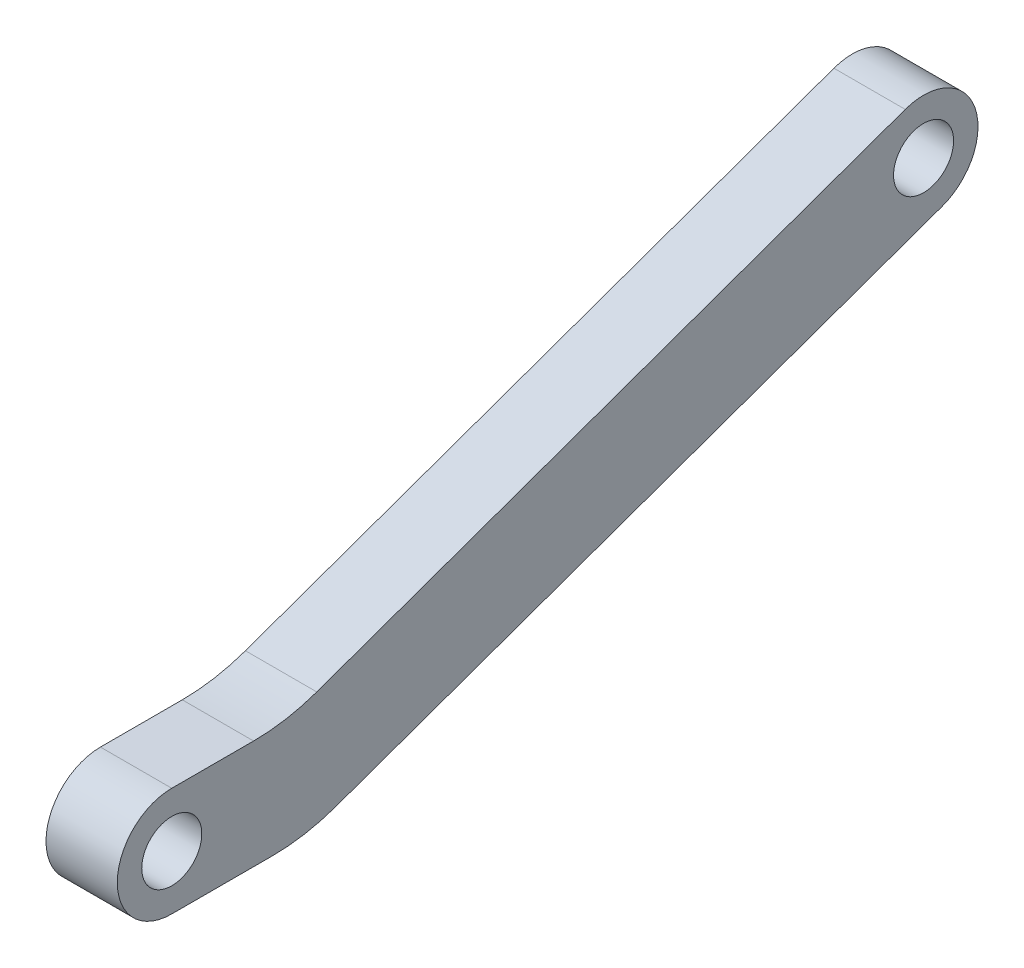
ISO-10303-21;
HEADER;
FILE_DESCRIPTION(('STEP AP214'),'2;1');
FILE_NAME('part.step','',(''),(''),'','','');
FILE_SCHEMA(('AUTOMOTIVE_DESIGN { 1 0 10303 214 1 1 1 1 }'));
ENDSEC;
DATA;
#1=APPLICATION_CONTEXT('core data for automotive mechanical design processes');
#2=APPLICATION_PROTOCOL_DEFINITION('international standard','automotive_design',2000,#1);
#3=PRODUCT_CONTEXT('',#1,'mechanical');
#4=PRODUCT('Part','Part','',(#3));
#5=PRODUCT_RELATED_PRODUCT_CATEGORY('part','',(#4));
#6=PRODUCT_DEFINITION_FORMATION('','',#4);
#7=PRODUCT_DEFINITION_CONTEXT('part definition',#1,'design');
#8=PRODUCT_DEFINITION('design','',#6,#7);
#9=PRODUCT_DEFINITION_SHAPE('','',#8);
#10=(LENGTH_UNIT() NAMED_UNIT(*) SI_UNIT(.MILLI.,.METRE.));
#11=(NAMED_UNIT(*) PLANE_ANGLE_UNIT() SI_UNIT($,.RADIAN.));
#12=(NAMED_UNIT(*) SI_UNIT($,.STERADIAN.) SOLID_ANGLE_UNIT());
#13=UNCERTAINTY_MEASURE_WITH_UNIT(LENGTH_MEASURE(1.E-05),#10,'distance_accuracy_value','');
#14=(GEOMETRIC_REPRESENTATION_CONTEXT(3) GLOBAL_UNCERTAINTY_ASSIGNED_CONTEXT((#13)) GLOBAL_UNIT_ASSIGNED_CONTEXT((#10,
#11,#12)) REPRESENTATION_CONTEXT('',''));
#15=CARTESIAN_POINT('',(0.,0.,0.));
#16=DIRECTION('',(0.,0.,1.));
#17=DIRECTION('',(1.,0.,0.));
#18=AXIS2_PLACEMENT_3D('',#15,#16,#17);
#19=CARTESIAN_POINT('',(1.9,7.1,-5.36430945089111));
#20=DIRECTION('',(1.,0.,0.));
#21=DIRECTION('',(0.,0.,-1.));
#22=AXIS2_PLACEMENT_3D('',#19,#20,#21);
#23=PLANE('',#22);
#24=CARTESIAN_POINT('',(1.9,0.,0.));
#25=DIRECTION('',(1.,0.,0.));
#26=DIRECTION('',(0.,0.,-1.));
#27=AXIS2_PLACEMENT_3D('',#24,#25,#26);
#28=CIRCLE('',#27,1.6);
#29=CARTESIAN_POINT('',(1.9,0.,1.6));
#30=VERTEX_POINT('',#29);
#31=EDGE_CURVE('E142',#30,#30,#28,.T.);
#32=ORIENTED_EDGE('',*,*,#31,.F.);
#33=EDGE_LOOP('',(#32));
#34=FACE_BOUND('',#33,.T.);
#35=CARTESIAN_POINT('',(1.9,7.1,-5.36430945089111));
#36=DIRECTION('',(1.,0.,0.));
#37=DIRECTION('',(0.,0.,-1.));
#38=AXIS2_PLACEMENT_3D('',#35,#36,#37);
#39=CIRCLE('',#38,10.);
#40=CARTESIAN_POINT('',(1.9,-2.9,-5.36430945089111));
#41=VERTEX_POINT('',#40);
#42=CARTESIAN_POINT('',(1.9,-2.31728298081775,-8.72805457488616));
#43=VERTEX_POINT('',#42);
#44=EDGE_CURVE('E153',#41,#43,#39,.T.);
#45=ORIENTED_EDGE('',*,*,#44,.T.);
#46=DIRECTION('',(0.,0.336374512399505,-0.941728298081774));
#47=VECTOR('',#46,1.);
#48=CARTESIAN_POINT('',(1.9,-2.31728298081775,-8.72805457488616));
#49=LINE('',#48,#47);
#50=CARTESIAN_POINT('',(1.9,9.21898793556285,-41.0254860859586));
#51=VERTEX_POINT('',#50);
#52=EDGE_CURVE('E101',#43,#51,#49,.T.);
#53=ORIENTED_EDGE('',*,*,#52,.T.);
#54=CARTESIAN_POINT('',(1.9,11.95,-40.05));
#55=DIRECTION('',(1.,0.,0.));
#56=DIRECTION('',(0.,0.,-1.));
#57=AXIS2_PLACEMENT_3D('',#54,#55,#56);
#58=CIRCLE('',#57,2.9);
#59=CARTESIAN_POINT('',(1.9,14.6810120644371,-39.0745139140414));
#60=VERTEX_POINT('',#59);
#61=EDGE_CURVE('E168',#51,#60,#58,.T.);
#62=ORIENTED_EDGE('',*,*,#61,.T.);
#63=DIRECTION('',(0.,-0.336374512399505,0.941728298081775));
#64=VECTOR('',#63,1.);
#65=CARTESIAN_POINT('',(1.9,3.48271701918226,-7.72329393260449));
#66=LINE('',#65,#64);
#67=CARTESIAN_POINT('',(1.9,3.48271701918225,-7.72329393260448));
#68=VERTEX_POINT('',#67);
#69=EDGE_CURVE('E181',#60,#68,#66,.T.);
#70=ORIENTED_EDGE('',*,*,#69,.T.);
#71=CARTESIAN_POINT('',(1.9,12.9,-4.35954880860944));
#72=DIRECTION('',(-1.,0.,0.));
#73=DIRECTION('',(0.,0.,-1.));
#74=AXIS2_PLACEMENT_3D('',#71,#72,#73);
#75=CIRCLE('',#74,10.);
#76=CARTESIAN_POINT('',(1.9,2.9,-4.35954880860944));
#77=VERTEX_POINT('',#76);
#78=EDGE_CURVE('E120',#68,#77,#75,.T.);
#79=ORIENTED_EDGE('',*,*,#78,.T.);
#80=DIRECTION('',(0.,0.,1.));
#81=VECTOR('',#80,1.);
#82=CARTESIAN_POINT('',(1.9,2.9,0.));
#83=LINE('',#82,#81);
#84=CARTESIAN_POINT('',(1.9,2.9,0.));
#85=VERTEX_POINT('',#84);
#86=EDGE_CURVE('E114',#77,#85,#83,.T.);
#87=ORIENTED_EDGE('',*,*,#86,.T.);
#88=CARTESIAN_POINT('',(1.9,0.,0.));
#89=DIRECTION('',(1.,0.,0.));
#90=DIRECTION('',(0.,0.,-1.));
#91=AXIS2_PLACEMENT_3D('',#88,#89,#90);
#92=CIRCLE('',#91,2.9);
#93=CARTESIAN_POINT('',(1.9,-2.9,0.));
#94=VERTEX_POINT('',#93);
#95=EDGE_CURVE('E118',#85,#94,#92,.T.);
#96=ORIENTED_EDGE('',*,*,#95,.T.);
#97=DIRECTION('',(0.,0.,-1.));
#98=VECTOR('',#97,1.);
#99=CARTESIAN_POINT('',(1.9,-2.9,0.));
#100=LINE('',#99,#98);
#101=EDGE_CURVE('E58',#94,#41,#100,.T.);
#102=ORIENTED_EDGE('',*,*,#101,.T.);
#103=EDGE_LOOP('',(#45,#53,#62,#70,#79,#87,#96,#102));
#104=FACE_BOUND('',#103,.T.);
#105=CARTESIAN_POINT('',(1.9,11.95,-40.05));
#106=DIRECTION('',(1.,0.,0.));
#107=DIRECTION('',(0.,0.,-1.));
#108=AXIS2_PLACEMENT_3D('',#105,#106,#107);
#109=CIRCLE('',#108,1.6);
#110=CARTESIAN_POINT('',(1.9,11.95,-38.45));
#111=VERTEX_POINT('',#110);
#112=EDGE_CURVE('E190',#111,#111,#109,.T.);
#113=ORIENTED_EDGE('',*,*,#112,.F.);
#114=EDGE_LOOP('',(#113));
#115=FACE_BOUND('',#114,.T.);
#116=ADVANCED_FACE('F41',(#34,#104,#115),#23,.T.);
#117=CARTESIAN_POINT('',(-1.9,7.1,-5.36430945089111));
#118=DIRECTION('',(1.,0.,0.));
#119=DIRECTION('',(0.,0.,-1.));
#120=AXIS2_PLACEMENT_3D('',#117,#118,#119);
#121=PLANE('',#120);
#122=CARTESIAN_POINT('',(-1.9,7.1,-5.36430945089111));
#123=DIRECTION('',(1.,0.,0.));
#124=DIRECTION('',(0.,0.,-1.));
#125=AXIS2_PLACEMENT_3D('',#122,#123,#124);
#126=CIRCLE('',#125,10.);
#127=CARTESIAN_POINT('',(-1.9,-2.9,-5.36430945089111));
#128=VERTEX_POINT('',#127);
#129=CARTESIAN_POINT('',(-1.9,-2.31728298081775,-8.72805457488616));
#130=VERTEX_POINT('',#129);
#131=EDGE_CURVE('E138',#128,#130,#126,.T.);
#132=ORIENTED_EDGE('',*,*,#131,.F.);
#133=DIRECTION('',(0.,0.,-1.));
#134=VECTOR('',#133,1.);
#135=CARTESIAN_POINT('',(-1.9,-2.9,0.));
#136=LINE('',#135,#134);
#137=CARTESIAN_POINT('',(-1.9,-2.9,0.));
#138=VERTEX_POINT('',#137);
#139=EDGE_CURVE('E93',#138,#128,#136,.T.);
#140=ORIENTED_EDGE('',*,*,#139,.F.);
#141=CARTESIAN_POINT('',(-1.9,0.,0.));
#142=DIRECTION('',(1.,0.,0.));
#143=DIRECTION('',(0.,0.,-1.));
#144=AXIS2_PLACEMENT_3D('',#141,#142,#143);
#145=CIRCLE('',#144,2.9);
#146=CARTESIAN_POINT('',(-1.9,2.9,0.));
#147=VERTEX_POINT('',#146);
#148=EDGE_CURVE('E87',#147,#138,#145,.T.);
#149=ORIENTED_EDGE('',*,*,#148,.F.);
#150=DIRECTION('',(0.,0.,1.));
#151=VECTOR('',#150,1.);
#152=CARTESIAN_POINT('',(-1.9,2.9,0.));
#153=LINE('',#152,#151);
#154=CARTESIAN_POINT('',(-1.9,2.9,-4.35954880860944));
#155=VERTEX_POINT('',#154);
#156=EDGE_CURVE('E128',#155,#147,#153,.T.);
#157=ORIENTED_EDGE('',*,*,#156,.F.);
#158=CARTESIAN_POINT('',(-1.9,12.9,-4.35954880860944));
#159=DIRECTION('',(-1.,0.,0.));
#160=DIRECTION('',(0.,0.,-1.));
#161=AXIS2_PLACEMENT_3D('',#158,#159,#160);
#162=CIRCLE('',#161,10.);
#163=CARTESIAN_POINT('',(-1.9,3.48271701918225,-7.72329393260448));
#164=VERTEX_POINT('',#163);
#165=EDGE_CURVE('E148',#164,#155,#162,.T.);
#166=ORIENTED_EDGE('',*,*,#165,.F.);
#167=DIRECTION('',(0.,-0.336374512399505,0.941728298081775));
#168=VECTOR('',#167,1.);
#169=CARTESIAN_POINT('',(-1.9,3.48271701918226,-7.72329393260449));
#170=LINE('',#169,#168);
#171=CARTESIAN_POINT('',(-1.9,14.6810120644371,-39.0745139140414));
#172=VERTEX_POINT('',#171);
#173=EDGE_CURVE('E146',#172,#164,#170,.T.);
#174=ORIENTED_EDGE('',*,*,#173,.F.);
#175=CARTESIAN_POINT('',(-1.9,11.95,-40.05));
#176=DIRECTION('',(1.,0.,0.));
#177=DIRECTION('',(0.,0.,-1.));
#178=AXIS2_PLACEMENT_3D('',#175,#176,#177);
#179=CIRCLE('',#178,2.9);
#180=CARTESIAN_POINT('',(-1.9,9.21898793556285,-41.0254860859586));
#181=VERTEX_POINT('',#180);
#182=EDGE_CURVE('E144',#181,#172,#179,.T.);
#183=ORIENTED_EDGE('',*,*,#182,.F.);
#184=DIRECTION('',(0.,0.336374512399505,-0.941728298081774));
#185=VECTOR('',#184,1.);
#186=CARTESIAN_POINT('',(-1.9,-2.31728298081775,-8.72805457488616));
#187=LINE('',#186,#185);
#188=EDGE_CURVE('E141',#130,#181,#187,.T.);
#189=ORIENTED_EDGE('',*,*,#188,.F.);
#190=EDGE_LOOP('',(#132,#140,#149,#157,#166,#174,#183,#189));
#191=FACE_BOUND('',#190,.T.);
#192=CARTESIAN_POINT('',(-1.9,0.,0.));
#193=DIRECTION('',(1.,0.,0.));
#194=DIRECTION('',(0.,0.,-1.));
#195=AXIS2_PLACEMENT_3D('',#192,#193,#194);
#196=CIRCLE('',#195,1.6);
#197=CARTESIAN_POINT('',(-1.9,0.,1.6));
#198=VERTEX_POINT('',#197);
#199=EDGE_CURVE('E187',#198,#198,#196,.T.);
#200=ORIENTED_EDGE('',*,*,#199,.T.);
#201=EDGE_LOOP('',(#200));
#202=FACE_BOUND('',#201,.T.);
#203=CARTESIAN_POINT('',(-1.9,11.95,-40.05));
#204=DIRECTION('',(1.,0.,0.));
#205=DIRECTION('',(0.,0.,-1.));
#206=AXIS2_PLACEMENT_3D('',#203,#204,#205);
#207=CIRCLE('',#206,1.6);
#208=CARTESIAN_POINT('',(-1.9,11.95,-38.45));
#209=VERTEX_POINT('',#208);
#210=EDGE_CURVE('E193',#209,#209,#207,.T.);
#211=ORIENTED_EDGE('',*,*,#210,.T.);
#212=EDGE_LOOP('',(#211));
#213=FACE_BOUND('',#212,.T.);
#214=ADVANCED_FACE('F172',(#191,#202,#213),#121,.F.);
#215=CARTESIAN_POINT('',(1.9,7.1,-5.36430945089111));
#216=DIRECTION('',(-1.,0.,0.));
#217=DIRECTION('',(0.,0.,1.));
#218=AXIS2_PLACEMENT_3D('',#215,#216,#217);
#219=CYLINDRICAL_SURFACE('',#218,10.);
#220=ORIENTED_EDGE('',*,*,#131,.T.);
#221=DIRECTION('',(-1.,0.,0.));
#222=VECTOR('',#221,1.);
#223=CARTESIAN_POINT('',(1.9,-2.31728298081775,-8.72805457488616));
#224=LINE('',#223,#222);
#225=EDGE_CURVE('E11',#43,#130,#224,.T.);
#226=ORIENTED_EDGE('',*,*,#225,.F.);
#227=ORIENTED_EDGE('',*,*,#44,.F.);
#228=DIRECTION('',(-1.,0.,0.));
#229=VECTOR('',#228,1.);
#230=CARTESIAN_POINT('',(1.9,-2.9,-5.36430945089111));
#231=LINE('',#230,#229);
#232=EDGE_CURVE('E134',#41,#128,#231,.T.);
#233=ORIENTED_EDGE('',*,*,#232,.T.);
#234=EDGE_LOOP('',(#220,#226,#227,#233));
#235=FACE_BOUND('',#234,.T.);
#236=ADVANCED_FACE('F43',(#235),#219,.T.);
#237=CARTESIAN_POINT('',(1.9,-2.31728298081775,-8.72805457488616));
#238=DIRECTION('',(0.,0.941728298081774,0.336374512399505));
#239=DIRECTION('',(0.,-0.336374512399505,0.941728298081774));
#240=AXIS2_PLACEMENT_3D('',#237,#238,#239);
#241=PLANE('',#240);
#242=ORIENTED_EDGE('',*,*,#188,.T.);
#243=DIRECTION('',(-1.,0.,0.));
#244=VECTOR('',#243,1.);
#245=CARTESIAN_POINT('',(1.9,9.21898793556285,-41.0254860859586));
#246=LINE('',#245,#244);
#247=EDGE_CURVE('E50',#51,#181,#246,.T.);
#248=ORIENTED_EDGE('',*,*,#247,.F.);
#249=ORIENTED_EDGE('',*,*,#52,.F.);
#250=ORIENTED_EDGE('',*,*,#225,.T.);
#251=EDGE_LOOP('',(#242,#248,#249,#250));
#252=FACE_BOUND('',#251,.T.);
#253=ADVANCED_FACE('F225',(#252),#241,.F.);
#254=CARTESIAN_POINT('',(1.9,11.95,-40.05));
#255=DIRECTION('',(-1.,0.,0.));
#256=DIRECTION('',(0.,0.,1.));
#257=AXIS2_PLACEMENT_3D('',#254,#255,#256);
#258=CYLINDRICAL_SURFACE('',#257,2.9);
#259=ORIENTED_EDGE('',*,*,#182,.T.);
#260=DIRECTION('',(-1.,0.,0.));
#261=VECTOR('',#260,1.);
#262=CARTESIAN_POINT('',(1.9,14.6810120644371,-39.0745139140414));
#263=LINE('',#262,#261);
#264=EDGE_CURVE('E160',#60,#172,#263,.T.);
#265=ORIENTED_EDGE('',*,*,#264,.F.);
#266=ORIENTED_EDGE('',*,*,#61,.F.);
#267=ORIENTED_EDGE('',*,*,#247,.T.);
#268=EDGE_LOOP('',(#259,#265,#266,#267));
#269=FACE_BOUND('',#268,.T.);
#270=ADVANCED_FACE('F166',(#269),#258,.T.);
#271=CARTESIAN_POINT('',(1.9,3.48271701918226,-7.72329393260449));
#272=DIRECTION('',(0.,-0.941728298081774,-0.336374512399505));
#273=DIRECTION('',(0.,0.336374512399505,-0.941728298081774));
#274=AXIS2_PLACEMENT_3D('',#271,#272,#273);
#275=PLANE('',#274);
#276=ORIENTED_EDGE('',*,*,#173,.T.);
#277=DIRECTION('',(-1.,0.,0.));
#278=VECTOR('',#277,1.);
#279=CARTESIAN_POINT('',(1.9,3.48271701918225,-7.72329393260448));
#280=LINE('',#279,#278);
#281=EDGE_CURVE('E157',#68,#164,#280,.T.);
#282=ORIENTED_EDGE('',*,*,#281,.F.);
#283=ORIENTED_EDGE('',*,*,#69,.F.);
#284=ORIENTED_EDGE('',*,*,#264,.T.);
#285=EDGE_LOOP('',(#276,#282,#283,#284));
#286=FACE_BOUND('',#285,.T.);
#287=ADVANCED_FACE('F177',(#286),#275,.F.);
#288=CARTESIAN_POINT('',(1.9,12.9,-4.35954880860944));
#289=DIRECTION('',(-1.,0.,0.));
#290=DIRECTION('',(0.,0.,1.));
#291=AXIS2_PLACEMENT_3D('',#288,#289,#290);
#292=CYLINDRICAL_SURFACE('',#291,10.);
#293=ORIENTED_EDGE('',*,*,#165,.T.);
#294=DIRECTION('',(-1.,0.,0.));
#295=VECTOR('',#294,1.);
#296=CARTESIAN_POINT('',(1.9,2.9,-4.35954880860944));
#297=LINE('',#296,#295);
#298=EDGE_CURVE('E129',#77,#155,#297,.T.);
#299=ORIENTED_EDGE('',*,*,#298,.F.);
#300=ORIENTED_EDGE('',*,*,#78,.F.);
#301=ORIENTED_EDGE('',*,*,#281,.T.);
#302=EDGE_LOOP('',(#293,#299,#300,#301));
#303=FACE_BOUND('',#302,.T.);
#304=ADVANCED_FACE('F180',(#303),#292,.F.);
#305=CARTESIAN_POINT('',(1.9,2.9,0.));
#306=DIRECTION('',(0.,-1.,0.));
#307=DIRECTION('',(0.,0.,-1.));
#308=AXIS2_PLACEMENT_3D('',#305,#306,#307);
#309=PLANE('',#308);
#310=ORIENTED_EDGE('',*,*,#156,.T.);
#311=DIRECTION('',(-1.,0.,0.));
#312=VECTOR('',#311,1.);
#313=CARTESIAN_POINT('',(1.9,2.9,0.));
#314=LINE('',#313,#312);
#315=EDGE_CURVE('E125',#85,#147,#314,.T.);
#316=ORIENTED_EDGE('',*,*,#315,.F.);
#317=ORIENTED_EDGE('',*,*,#86,.F.);
#318=ORIENTED_EDGE('',*,*,#298,.T.);
#319=EDGE_LOOP('',(#310,#316,#317,#318));
#320=FACE_BOUND('',#319,.T.);
#321=ADVANCED_FACE('F126',(#320),#309,.F.);
#322=CARTESIAN_POINT('',(1.9,0.,0.));
#323=DIRECTION('',(-1.,0.,0.));
#324=DIRECTION('',(0.,0.,1.));
#325=AXIS2_PLACEMENT_3D('',#322,#323,#324);
#326=CYLINDRICAL_SURFACE('',#325,2.9);
#327=ORIENTED_EDGE('',*,*,#148,.T.);
#328=DIRECTION('',(-1.,0.,0.));
#329=VECTOR('',#328,1.);
#330=CARTESIAN_POINT('',(1.9,-2.9,0.));
#331=LINE('',#330,#329);
#332=EDGE_CURVE('E130',#94,#138,#331,.T.);
#333=ORIENTED_EDGE('',*,*,#332,.F.);
#334=ORIENTED_EDGE('',*,*,#95,.F.);
#335=ORIENTED_EDGE('',*,*,#315,.T.);
#336=EDGE_LOOP('',(#327,#333,#334,#335));
#337=FACE_BOUND('',#336,.T.);
#338=ADVANCED_FACE('F132',(#337),#326,.T.);
#339=CARTESIAN_POINT('',(1.9,-2.9,0.));
#340=DIRECTION('',(0.,1.,0.));
#341=DIRECTION('',(0.,0.,1.));
#342=AXIS2_PLACEMENT_3D('',#339,#340,#341);
#343=PLANE('',#342);
#344=ORIENTED_EDGE('',*,*,#139,.T.);
#345=ORIENTED_EDGE('',*,*,#232,.F.);
#346=ORIENTED_EDGE('',*,*,#101,.F.);
#347=ORIENTED_EDGE('',*,*,#332,.T.);
#348=EDGE_LOOP('',(#344,#345,#346,#347));
#349=FACE_BOUND('',#348,.T.);
#350=ADVANCED_FACE('F213',(#349),#343,.F.);
#351=CARTESIAN_POINT('',(1.9,0.,0.));
#352=DIRECTION('',(-1.,0.,0.));
#353=DIRECTION('',(0.,0.,1.));
#354=AXIS2_PLACEMENT_3D('',#351,#352,#353);
#355=CYLINDRICAL_SURFACE('',#354,1.6);
#356=CARTESIAN_POINT('',(1.9,0.,1.6));
#357=CARTESIAN_POINT('',(1.86041666666667,0.,1.6));
#358=CARTESIAN_POINT('',(1.82083333333333,0.,1.6));
#359=CARTESIAN_POINT('',(1.74166666666667,0.,1.6));
#360=CARTESIAN_POINT('',(1.70208333333333,0.,1.6));
#361=CARTESIAN_POINT('',(1.62291666666667,0.,1.6));
#362=CARTESIAN_POINT('',(1.58333333333333,0.,1.6));
#363=CARTESIAN_POINT('',(1.50416666666667,0.,1.6));
#364=CARTESIAN_POINT('',(1.46458333333333,0.,1.6));
#365=CARTESIAN_POINT('',(1.38541666666667,0.,1.6));
#366=CARTESIAN_POINT('',(1.34583333333333,0.,1.6));
#367=CARTESIAN_POINT('',(1.26666666666667,0.,1.6));
#368=CARTESIAN_POINT('',(1.22708333333333,0.,1.6));
#369=CARTESIAN_POINT('',(1.14791666666667,0.,1.6));
#370=CARTESIAN_POINT('',(1.10833333333333,0.,1.6));
#371=CARTESIAN_POINT('',(1.02916666666667,0.,1.6));
#372=CARTESIAN_POINT('',(0.989583333333333,0.,1.6));
#373=CARTESIAN_POINT('',(0.910416666666667,0.,1.6));
#374=CARTESIAN_POINT('',(0.870833333333333,0.,1.6));
#375=CARTESIAN_POINT('',(0.791666666666667,0.,1.6));
#376=CARTESIAN_POINT('',(0.752083333333333,0.,1.6));
#377=CARTESIAN_POINT('',(0.672916666666666,0.,1.6));
#378=CARTESIAN_POINT('',(0.633333333333333,0.,1.6));
#379=CARTESIAN_POINT('',(0.554166666666667,0.,1.6));
#380=CARTESIAN_POINT('',(0.514583333333333,0.,1.6));
#381=CARTESIAN_POINT('',(0.435416666666667,0.,1.6));
#382=CARTESIAN_POINT('',(0.395833333333333,0.,1.6));
#383=CARTESIAN_POINT('',(0.316666666666666,0.,1.6));
#384=CARTESIAN_POINT('',(0.277083333333333,0.,1.6));
#385=CARTESIAN_POINT('',(0.197916666666666,0.,1.6));
#386=CARTESIAN_POINT('',(0.158333333333333,0.,1.6));
#387=CARTESIAN_POINT('',(0.0791666666666664,0.,1.6));
#388=CARTESIAN_POINT('',(0.0395833333333331,0.,1.6));
#389=CARTESIAN_POINT('',(-0.0395833333333334,0.,1.6));
#390=CARTESIAN_POINT('',(-0.0791666666666665,0.,1.6));
#391=CARTESIAN_POINT('',(-0.158333333333333,0.,1.6));
#392=CARTESIAN_POINT('',(-0.197916666666666,0.,1.6));
#393=CARTESIAN_POINT('',(-0.277083333333333,0.,1.6));
#394=CARTESIAN_POINT('',(-0.316666666666667,0.,1.6));
#395=CARTESIAN_POINT('',(-0.395833333333333,0.,1.6));
#396=CARTESIAN_POINT('',(-0.435416666666667,0.,1.6));
#397=CARTESIAN_POINT('',(-0.514583333333333,0.,1.6));
#398=CARTESIAN_POINT('',(-0.554166666666667,0.,1.6));
#399=CARTESIAN_POINT('',(-0.633333333333333,0.,1.6));
#400=CARTESIAN_POINT('',(-0.672916666666666,0.,1.6));
#401=CARTESIAN_POINT('',(-0.752083333333333,0.,1.6));
#402=CARTESIAN_POINT('',(-0.791666666666666,0.,1.6));
#403=CARTESIAN_POINT('',(-0.870833333333333,0.,1.6));
#404=CARTESIAN_POINT('',(-0.910416666666666,0.,1.6));
#405=CARTESIAN_POINT('',(-0.989583333333333,0.,1.6));
#406=CARTESIAN_POINT('',(-1.02916666666667,0.,1.6));
#407=CARTESIAN_POINT('',(-1.10833333333333,0.,1.6));
#408=CARTESIAN_POINT('',(-1.14791666666667,0.,1.6));
#409=CARTESIAN_POINT('',(-1.22708333333333,0.,1.6));
#410=CARTESIAN_POINT('',(-1.26666666666667,0.,1.6));
#411=CARTESIAN_POINT('',(-1.34583333333333,0.,1.6));
#412=CARTESIAN_POINT('',(-1.38541666666667,0.,1.6));
#413=CARTESIAN_POINT('',(-1.46458333333333,0.,1.6));
#414=CARTESIAN_POINT('',(-1.50416666666667,0.,1.6));
#415=CARTESIAN_POINT('',(-1.58333333333333,0.,1.6));
#416=CARTESIAN_POINT('',(-1.62291666666667,0.,1.6));
#417=CARTESIAN_POINT('',(-1.70208333333333,0.,1.6));
#418=CARTESIAN_POINT('',(-1.74166666666667,0.,1.6));
#419=CARTESIAN_POINT('',(-1.82083333333333,0.,1.6));
#420=CARTESIAN_POINT('',(-1.86041666666667,0.,1.6));
#421=CARTESIAN_POINT('',(-1.9,0.,1.6));
#422=B_SPLINE_CURVE_WITH_KNOTS('',3,(#356,#357,#358,#359,#360,#361,#362,#363,#364,#365,#366,
#367,#368,#369,#370,#371,#372,#373,#374,#375,#376,#377,#378,#379,#380,#381,#382,#383,#384,#385,
#386,#387,#388,#389,#390,#391,#392,#393,#394,#395,#396,#397,#398,#399,#400,#401,#402,#403,#404,
#405,#406,#407,#408,#409,#410,#411,#412,#413,#414,#415,#416,#417,#418,#419,#420,#421),
.UNSPECIFIED.,.F.,.F.,(4,2,2,2,2,2,2,2,2,2,2,2,2,2,2,2,2,2,2,2,2,2,2,2,2,2,2,2,2,2,2,2,4),(0.,
0.11875,0.2375,0.35625,0.475,0.59375,0.7125,0.83125,0.95,1.06875,1.1875,1.30625,1.425,1.54375,
1.6625,1.78125,1.9,2.01875,2.1375,2.25625,2.375,2.49375,2.6125,2.73125,2.85,2.96875,3.0875,
3.20625,3.325,3.44375,3.5625,3.68125,3.8),.UNSPECIFIED.);
#423=EDGE_CURVE('BSEAM210',#30,#198,#422,.T.);
#424=ORIENTED_EDGE('',*,*,#31,.T.);
#425=ORIENTED_EDGE('',*,*,#199,.F.);
#426=ORIENTED_EDGE('',*,*,#423,.T.);
#427=ORIENTED_EDGE('',*,*,#423,.F.);
#428=EDGE_LOOP('',(#424,#426,#425,#427));
#429=FACE_BOUND('',#428,.T.);
#430=ADVANCED_FACE('F210',(#429),#355,.F.);
#431=CARTESIAN_POINT('',(1.9,11.95,-40.05));
#432=DIRECTION('',(-1.,0.,0.));
#433=DIRECTION('',(0.,0.,1.));
#434=AXIS2_PLACEMENT_3D('',#431,#432,#433);
#435=CYLINDRICAL_SURFACE('',#434,1.6);
#436=CARTESIAN_POINT('',(1.9,11.95,-38.45));
#437=CARTESIAN_POINT('',(1.86041666666667,11.95,-38.45));
#438=CARTESIAN_POINT('',(1.82083333333333,11.95,-38.45));
#439=CARTESIAN_POINT('',(1.74166666666667,11.95,-38.45));
#440=CARTESIAN_POINT('',(1.70208333333333,11.95,-38.45));
#441=CARTESIAN_POINT('',(1.62291666666667,11.95,-38.45));
#442=CARTESIAN_POINT('',(1.58333333333333,11.95,-38.45));
#443=CARTESIAN_POINT('',(1.50416666666667,11.95,-38.45));
#444=CARTESIAN_POINT('',(1.46458333333333,11.95,-38.45));
#445=CARTESIAN_POINT('',(1.38541666666667,11.95,-38.45));
#446=CARTESIAN_POINT('',(1.34583333333333,11.95,-38.45));
#447=CARTESIAN_POINT('',(1.26666666666667,11.95,-38.45));
#448=CARTESIAN_POINT('',(1.22708333333333,11.95,-38.45));
#449=CARTESIAN_POINT('',(1.14791666666667,11.95,-38.45));
#450=CARTESIAN_POINT('',(1.10833333333333,11.95,-38.45));
#451=CARTESIAN_POINT('',(1.02916666666667,11.95,-38.45));
#452=CARTESIAN_POINT('',(0.989583333333333,11.95,-38.45));
#453=CARTESIAN_POINT('',(0.910416666666667,11.95,-38.45));
#454=CARTESIAN_POINT('',(0.870833333333333,11.95,-38.45));
#455=CARTESIAN_POINT('',(0.791666666666667,11.95,-38.45));
#456=CARTESIAN_POINT('',(0.752083333333333,11.95,-38.45));
#457=CARTESIAN_POINT('',(0.672916666666666,11.95,-38.45));
#458=CARTESIAN_POINT('',(0.633333333333333,11.95,-38.45));
#459=CARTESIAN_POINT('',(0.554166666666667,11.95,-38.45));
#460=CARTESIAN_POINT('',(0.514583333333333,11.95,-38.45));
#461=CARTESIAN_POINT('',(0.435416666666667,11.95,-38.45));
#462=CARTESIAN_POINT('',(0.395833333333333,11.95,-38.45));
#463=CARTESIAN_POINT('',(0.316666666666666,11.95,-38.45));
#464=CARTESIAN_POINT('',(0.277083333333333,11.95,-38.45));
#465=CARTESIAN_POINT('',(0.197916666666666,11.95,-38.45));
#466=CARTESIAN_POINT('',(0.158333333333333,11.95,-38.45));
#467=CARTESIAN_POINT('',(0.0791666666666664,11.95,-38.45));
#468=CARTESIAN_POINT('',(0.0395833333333331,11.95,-38.45));
#469=CARTESIAN_POINT('',(-0.0395833333333334,11.95,-38.45));
#470=CARTESIAN_POINT('',(-0.0791666666666665,11.95,-38.45));
#471=CARTESIAN_POINT('',(-0.158333333333333,11.95,-38.45));
#472=CARTESIAN_POINT('',(-0.197916666666666,11.95,-38.45));
#473=CARTESIAN_POINT('',(-0.277083333333333,11.95,-38.45));
#474=CARTESIAN_POINT('',(-0.316666666666667,11.95,-38.45));
#475=CARTESIAN_POINT('',(-0.395833333333333,11.95,-38.45));
#476=CARTESIAN_POINT('',(-0.435416666666667,11.95,-38.45));
#477=CARTESIAN_POINT('',(-0.514583333333333,11.95,-38.45));
#478=CARTESIAN_POINT('',(-0.554166666666667,11.95,-38.45));
#479=CARTESIAN_POINT('',(-0.633333333333333,11.95,-38.45));
#480=CARTESIAN_POINT('',(-0.672916666666666,11.95,-38.45));
#481=CARTESIAN_POINT('',(-0.752083333333333,11.95,-38.45));
#482=CARTESIAN_POINT('',(-0.791666666666666,11.95,-38.45));
#483=CARTESIAN_POINT('',(-0.870833333333333,11.95,-38.45));
#484=CARTESIAN_POINT('',(-0.910416666666666,11.95,-38.45));
#485=CARTESIAN_POINT('',(-0.989583333333333,11.95,-38.45));
#486=CARTESIAN_POINT('',(-1.02916666666667,11.95,-38.45));
#487=CARTESIAN_POINT('',(-1.10833333333333,11.95,-38.45));
#488=CARTESIAN_POINT('',(-1.14791666666667,11.95,-38.45));
#489=CARTESIAN_POINT('',(-1.22708333333333,11.95,-38.45));
#490=CARTESIAN_POINT('',(-1.26666666666667,11.95,-38.45));
#491=CARTESIAN_POINT('',(-1.34583333333333,11.95,-38.45));
#492=CARTESIAN_POINT('',(-1.38541666666667,11.95,-38.45));
#493=CARTESIAN_POINT('',(-1.46458333333333,11.95,-38.45));
#494=CARTESIAN_POINT('',(-1.50416666666667,11.95,-38.45));
#495=CARTESIAN_POINT('',(-1.58333333333333,11.95,-38.45));
#496=CARTESIAN_POINT('',(-1.62291666666667,11.95,-38.45));
#497=CARTESIAN_POINT('',(-1.70208333333333,11.95,-38.45));
#498=CARTESIAN_POINT('',(-1.74166666666667,11.95,-38.45));
#499=CARTESIAN_POINT('',(-1.82083333333333,11.95,-38.45));
#500=CARTESIAN_POINT('',(-1.86041666666667,11.95,-38.45));
#501=CARTESIAN_POINT('',(-1.9,11.95,-38.45));
#502=B_SPLINE_CURVE_WITH_KNOTS('',3,(#436,#437,#438,#439,#440,#441,#442,#443,#444,#445,#446,
#447,#448,#449,#450,#451,#452,#453,#454,#455,#456,#457,#458,#459,#460,#461,#462,#463,#464,#465,
#466,#467,#468,#469,#470,#471,#472,#473,#474,#475,#476,#477,#478,#479,#480,#481,#482,#483,#484,
#485,#486,#487,#488,#489,#490,#491,#492,#493,#494,#495,#496,#497,#498,#499,#500,#501),
.UNSPECIFIED.,.F.,.F.,(4,2,2,2,2,2,2,2,2,2,2,2,2,2,2,2,2,2,2,2,2,2,2,2,2,2,2,2,2,2,2,2,4),(0.,
0.11875,0.2375,0.35625,0.475,0.59375,0.7125,0.83125,0.95,1.06875,1.1875,1.30625,1.425,1.54375,
1.6625,1.78125,1.9,2.01875,2.1375,2.25625,2.375,2.49375,2.6125,2.73125,2.85,2.96875,3.0875,
3.20625,3.325,3.44375,3.5625,3.68125,3.8),.UNSPECIFIED.);
#503=EDGE_CURVE('BSEAM199',#111,#209,#502,.T.);
#504=ORIENTED_EDGE('',*,*,#112,.T.);
#505=ORIENTED_EDGE('',*,*,#210,.F.);
#506=ORIENTED_EDGE('',*,*,#503,.T.);
#507=ORIENTED_EDGE('',*,*,#503,.F.);
#508=EDGE_LOOP('',(#504,#506,#505,#507));
#509=FACE_BOUND('',#508,.T.);
#510=ADVANCED_FACE('F199',(#509),#435,.F.);
#511=CLOSED_SHELL('',(#116,#214,#236,#253,#270,#287,#304,#321,#338,#350,#430,#510));
#512=MANIFOLD_SOLID_BREP('B2',#511);
#513=ADVANCED_BREP_SHAPE_REPRESENTATION('',(#18,#512),#14);
#514=SHAPE_DEFINITION_REPRESENTATION(#9,#513);
ENDSEC;
END-ISO-10303-21;
